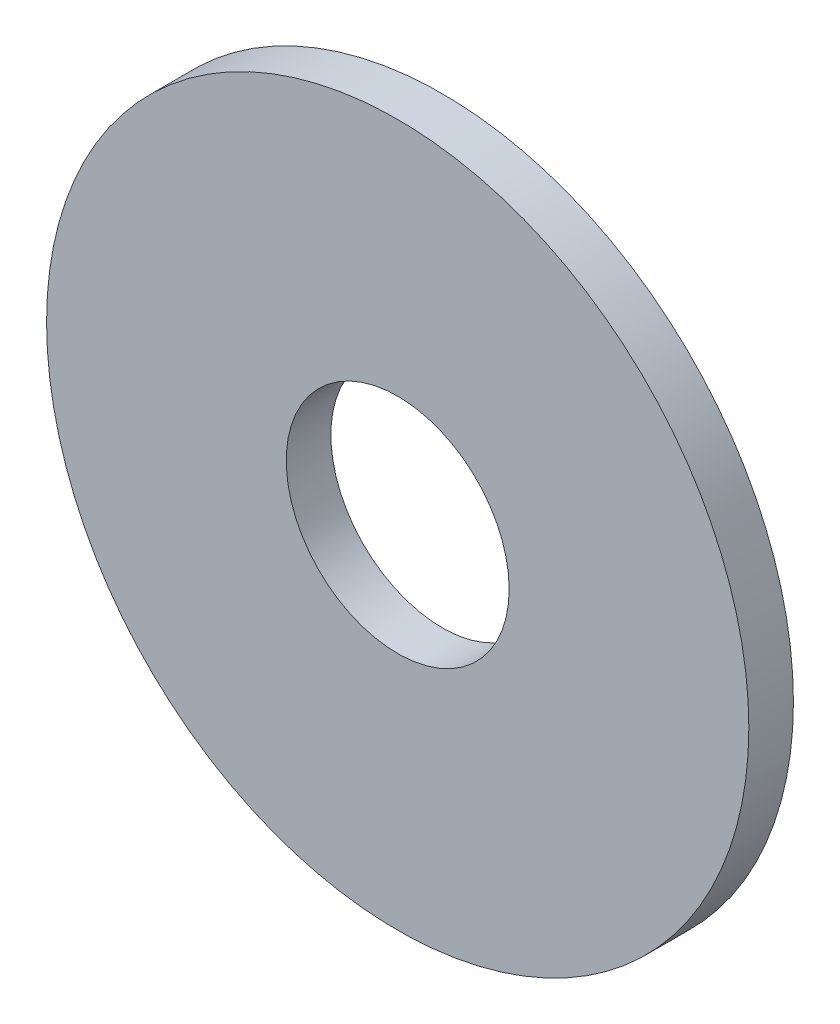
ISO-10303-21;
HEADER;
FILE_DESCRIPTION(('STEP AP214'),'2;1');
FILE_NAME('part.step','',(''),(''),'','','');
FILE_SCHEMA(('AUTOMOTIVE_DESIGN { 1 0 10303 214 1 1 1 1 }'));
ENDSEC;
DATA;
#1=APPLICATION_CONTEXT('core data for automotive mechanical design processes');
#2=APPLICATION_PROTOCOL_DEFINITION('international standard','automotive_design',2000,#1);
#3=PRODUCT_CONTEXT('',#1,'mechanical');
#4=PRODUCT('Part','Part','',(#3));
#5=PRODUCT_RELATED_PRODUCT_CATEGORY('part','',(#4));
#6=PRODUCT_DEFINITION_FORMATION('','',#4);
#7=PRODUCT_DEFINITION_CONTEXT('part definition',#1,'design');
#8=PRODUCT_DEFINITION('design','',#6,#7);
#9=PRODUCT_DEFINITION_SHAPE('','',#8);
#10=(LENGTH_UNIT() NAMED_UNIT(*) SI_UNIT(.MILLI.,.METRE.));
#11=(NAMED_UNIT(*) PLANE_ANGLE_UNIT() SI_UNIT($,.RADIAN.));
#12=(NAMED_UNIT(*) SI_UNIT($,.STERADIAN.) SOLID_ANGLE_UNIT());
#13=UNCERTAINTY_MEASURE_WITH_UNIT(LENGTH_MEASURE(1.E-05),#10,'distance_accuracy_value','');
#14=(GEOMETRIC_REPRESENTATION_CONTEXT(3) GLOBAL_UNCERTAINTY_ASSIGNED_CONTEXT((#13)) GLOBAL_UNIT_ASSIGNED_CONTEXT((#10,
#11,#12)) REPRESENTATION_CONTEXT('',''));
#15=CARTESIAN_POINT('',(0.,0.,0.));
#16=DIRECTION('',(0.,0.,1.));
#17=DIRECTION('',(1.,0.,0.));
#18=AXIS2_PLACEMENT_3D('',#15,#16,#17);
#19=CARTESIAN_POINT('',(-13.4918945432829,17.9545981229841,1.));
#20=DIRECTION('',(0.,0.,1.));
#21=DIRECTION('',(1.,0.,0.));
#22=AXIS2_PLACEMENT_3D('',#19,#20,#21);
#23=PLANE('',#22);
#24=CARTESIAN_POINT('',(-13.4918945432829,17.9545981229841,1.));
#25=DIRECTION('',(0.,0.,1.));
#26=DIRECTION('',(1.,0.,0.));
#27=AXIS2_PLACEMENT_3D('',#24,#25,#26);
#28=CIRCLE('',#27,7.875);
#29=CARTESIAN_POINT('',(-5.61689454328287,17.9545981229841,1.));
#30=VERTEX_POINT('',#29);
#31=EDGE_CURVE('E10',#30,#30,#28,.T.);
#32=ORIENTED_EDGE('',*,*,#31,.T.);
#33=EDGE_LOOP('',(#32));
#34=FACE_BOUND('',#33,.T.);
#35=CARTESIAN_POINT('',(-13.4918945432829,17.9545981229841,1.));
#36=DIRECTION('',(0.,0.,1.));
#37=DIRECTION('',(1.,0.,0.));
#38=AXIS2_PLACEMENT_3D('',#35,#36,#37);
#39=CIRCLE('',#38,2.5);
#40=CARTESIAN_POINT('',(-10.9918945432829,17.9545981229841,1.));
#41=VERTEX_POINT('',#40);
#42=EDGE_CURVE('E42',#41,#41,#39,.T.);
#43=ORIENTED_EDGE('',*,*,#42,.F.);
#44=EDGE_LOOP('',(#43));
#45=FACE_BOUND('',#44,.T.);
#46=ADVANCED_FACE('F31',(#34,#45),#23,.T.);
#47=CARTESIAN_POINT('',(-13.4918945432829,17.9545981229841,0.));
#48=DIRECTION('',(0.,0.,1.));
#49=DIRECTION('',(1.,0.,0.));
#50=AXIS2_PLACEMENT_3D('',#47,#48,#49);
#51=PLANE('',#50);
#52=CARTESIAN_POINT('',(-13.4918945432829,17.9545981229841,0.));
#53=DIRECTION('',(0.,0.,1.));
#54=DIRECTION('',(1.,0.,0.));
#55=AXIS2_PLACEMENT_3D('',#52,#53,#54);
#56=CIRCLE('',#55,7.875);
#57=CARTESIAN_POINT('',(-5.61689454328287,17.9545981229841,0.));
#58=VERTEX_POINT('',#57);
#59=EDGE_CURVE('E35',#58,#58,#56,.T.);
#60=ORIENTED_EDGE('',*,*,#59,.F.);
#61=EDGE_LOOP('',(#60));
#62=FACE_BOUND('',#61,.T.);
#63=CARTESIAN_POINT('',(-13.4918945432829,17.9545981229841,0.));
#64=DIRECTION('',(0.,0.,1.));
#65=DIRECTION('',(1.,0.,0.));
#66=AXIS2_PLACEMENT_3D('',#63,#64,#65);
#67=CIRCLE('',#66,2.5);
#68=CARTESIAN_POINT('',(-10.9918945432829,17.9545981229841,0.));
#69=VERTEX_POINT('',#68);
#70=EDGE_CURVE('E44',#69,#69,#67,.T.);
#71=ORIENTED_EDGE('',*,*,#70,.T.);
#72=EDGE_LOOP('',(#71));
#73=FACE_BOUND('',#72,.T.);
#74=ADVANCED_FACE('F54',(#62,#73),#51,.F.);
#75=CARTESIAN_POINT('',(-13.4918945432829,17.9545981229841,1.));
#76=DIRECTION('',(0.,0.,-1.));
#77=DIRECTION('',(-1.,0.,0.));
#78=AXIS2_PLACEMENT_3D('',#75,#76,#77);
#79=CYLINDRICAL_SURFACE('',#78,7.875);
#80=ORIENTED_EDGE('',*,*,#31,.F.);
#81=EDGE_LOOP('',(#80));
#82=FACE_BOUND('',#81,.T.);
#83=ORIENTED_EDGE('',*,*,#59,.T.);
#84=EDGE_LOOP('',(#83));
#85=FACE_BOUND('',#84,.T.);
#86=ADVANCED_FACE('F33',(#82,#85),#79,.T.);
#87=CARTESIAN_POINT('',(-13.4918945432829,17.9545981229841,1.));
#88=DIRECTION('',(0.,0.,-1.));
#89=DIRECTION('',(-1.,0.,0.));
#90=AXIS2_PLACEMENT_3D('',#87,#88,#89);
#91=CYLINDRICAL_SURFACE('',#90,2.5);
#92=ORIENTED_EDGE('',*,*,#42,.T.);
#93=EDGE_LOOP('',(#92));
#94=FACE_BOUND('',#93,.T.);
#95=ORIENTED_EDGE('',*,*,#70,.F.);
#96=EDGE_LOOP('',(#95));
#97=FACE_BOUND('',#96,.T.);
#98=ADVANCED_FACE('F50',(#94,#97),#91,.F.);
#99=CLOSED_SHELL('',(#46,#74,#86,#98));
#100=MANIFOLD_SOLID_BREP('B2',#99);
#101=ADVANCED_BREP_SHAPE_REPRESENTATION('',(#18,#100),#14);
#102=SHAPE_DEFINITION_REPRESENTATION(#9,#101);
ENDSEC;
END-ISO-10303-21;
